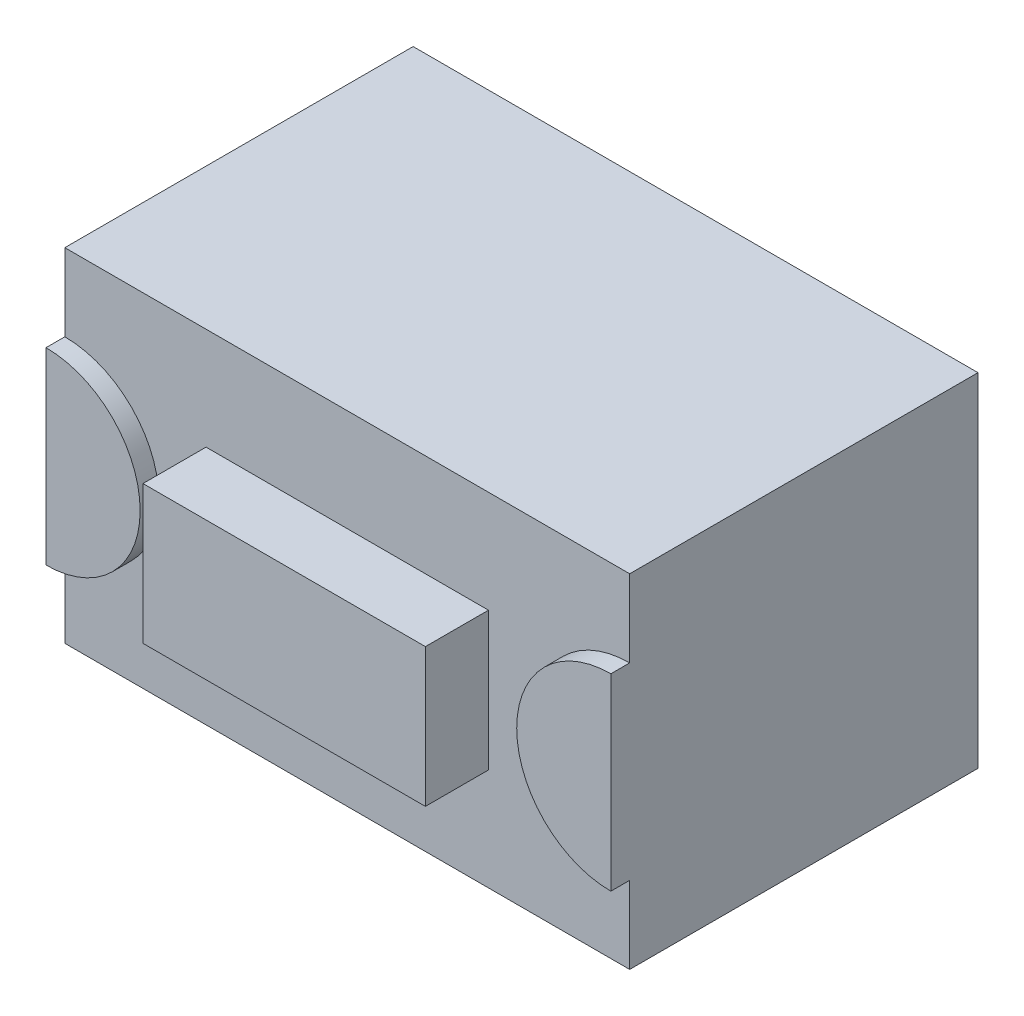
ISO-10303-21;
HEADER;
FILE_DESCRIPTION(('STEP AP214'),'2;1');
FILE_NAME('part.step','',(''),(''),'','','');
FILE_SCHEMA(('AUTOMOTIVE_DESIGN { 1 0 10303 214 1 1 1 1 }'));
ENDSEC;
DATA;
#1=APPLICATION_CONTEXT('core data for automotive mechanical design processes');
#2=APPLICATION_PROTOCOL_DEFINITION('international standard','automotive_design',2000,#1);
#3=PRODUCT_CONTEXT('',#1,'mechanical');
#4=PRODUCT('Part','Part','',(#3));
#5=PRODUCT_RELATED_PRODUCT_CATEGORY('part','',(#4));
#6=PRODUCT_DEFINITION_FORMATION('','',#4);
#7=PRODUCT_DEFINITION_CONTEXT('part definition',#1,'design');
#8=PRODUCT_DEFINITION('design','',#6,#7);
#9=PRODUCT_DEFINITION_SHAPE('','',#8);
#10=(LENGTH_UNIT() NAMED_UNIT(*) SI_UNIT(.MILLI.,.METRE.));
#11=(NAMED_UNIT(*) PLANE_ANGLE_UNIT() SI_UNIT($,.RADIAN.));
#12=(NAMED_UNIT(*) SI_UNIT($,.STERADIAN.) SOLID_ANGLE_UNIT());
#13=UNCERTAINTY_MEASURE_WITH_UNIT(LENGTH_MEASURE(1.E-05),#10,'distance_accuracy_value','');
#14=(GEOMETRIC_REPRESENTATION_CONTEXT(3) GLOBAL_UNCERTAINTY_ASSIGNED_CONTEXT((#13)) GLOBAL_UNIT_ASSIGNED_CONTEXT((#10,
#11,#12)) REPRESENTATION_CONTEXT('',''));
#15=CARTESIAN_POINT('',(0.,0.,0.));
#16=DIRECTION('',(0.,0.,1.));
#17=DIRECTION('',(1.,0.,0.));
#18=AXIS2_PLACEMENT_3D('',#15,#16,#17);
#19=CARTESIAN_POINT('',(0.,0.,4.37));
#20=DIRECTION('',(0.,0.,-1.));
#21=DIRECTION('',(-1.,0.,0.));
#22=AXIS2_PLACEMENT_3D('',#19,#20,#21);
#23=PLANE('',#22);
#24=DIRECTION('',(1.,0.,0.));
#25=VECTOR('',#24,1.);
#26=CARTESIAN_POINT('',(1.5,2.555,4.37));
#27=LINE('',#26,#25);
#28=CARTESIAN_POINT('',(4.5,2.555,4.37));
#29=VERTEX_POINT('',#28);
#30=CARTESIAN_POINT('',(1.5,2.555,4.37));
#31=VERTEX_POINT('',#30);
#32=EDGE_CURVE('E177',#29,#31,#27,.F.);
#33=ORIENTED_EDGE('',*,*,#32,.T.);
#34=DIRECTION('',(0.,1.,0.));
#35=VECTOR('',#34,1.);
#36=CARTESIAN_POINT('',(1.5,1.085,4.37));
#37=LINE('',#36,#35);
#38=CARTESIAN_POINT('',(1.5,1.085,4.37));
#39=VERTEX_POINT('',#38);
#40=EDGE_CURVE('E172',#31,#39,#37,.F.);
#41=ORIENTED_EDGE('',*,*,#40,.T.);
#42=DIRECTION('',(1.,0.,0.));
#43=VECTOR('',#42,1.);
#44=CARTESIAN_POINT('',(1.5,1.085,4.37));
#45=LINE('',#44,#43);
#46=CARTESIAN_POINT('',(4.5,1.085,4.37));
#47=VERTEX_POINT('',#46);
#48=EDGE_CURVE('E161',#39,#47,#45,.T.);
#49=ORIENTED_EDGE('',*,*,#48,.T.);
#50=DIRECTION('',(0.,1.,0.));
#51=VECTOR('',#50,1.);
#52=CARTESIAN_POINT('',(4.5,0.,4.37));
#53=LINE('',#52,#51);
#54=EDGE_CURVE('E137',#29,#47,#53,.F.);
#55=ORIENTED_EDGE('',*,*,#54,.F.);
#56=EDGE_LOOP('',(#33,#41,#49,#55));
#57=FACE_BOUND('',#56,.T.);
#58=ADVANCED_FACE('F17',(#57),#23,.F.);
#59=CARTESIAN_POINT('',(0.,1.82,3.9));
#60=DIRECTION('',(0.,0.,-1.));
#61=DIRECTION('',(-1.,0.,0.));
#62=AXIS2_PLACEMENT_3D('',#59,#60,#61);
#63=PLANE('',#62);
#64=DIRECTION('',(0.,1.,0.));
#65=VECTOR('',#64,1.);
#66=CARTESIAN_POINT('',(0.,0.,3.9));
#67=LINE('',#66,#65);
#68=CARTESIAN_POINT('',(0.,2.82,3.9));
#69=VERTEX_POINT('',#68);
#70=CARTESIAN_POINT('',(0.,0.82,3.9));
#71=VERTEX_POINT('',#70);
#72=EDGE_CURVE('E117',#69,#71,#67,.F.);
#73=ORIENTED_EDGE('',*,*,#72,.T.);
#74=CARTESIAN_POINT('',(0.,1.82,3.9));
#75=DIRECTION('',(0.,0.,-1.));
#76=DIRECTION('',(-1.,0.,0.));
#77=AXIS2_PLACEMENT_3D('',#74,#75,#76);
#78=CIRCLE('',#77,1.);
#79=EDGE_CURVE('E20',#69,#71,#78,.T.);
#80=ORIENTED_EDGE('',*,*,#79,.F.);
#81=EDGE_LOOP('',(#73,#80));
#82=FACE_BOUND('',#81,.T.);
#83=ADVANCED_FACE('F120',(#82),#63,.F.);
#84=CARTESIAN_POINT('',(0.,1.82,3.9));
#85=DIRECTION('',(0.,0.,-1.));
#86=DIRECTION('',(-1.,0.,0.));
#87=AXIS2_PLACEMENT_3D('',#84,#85,#86);
#88=CYLINDRICAL_SURFACE('',#87,1.);
#89=ORIENTED_EDGE('',*,*,#79,.T.);
#90=DIRECTION('',(0.,0.,-1.));
#91=VECTOR('',#90,1.);
#92=CARTESIAN_POINT('',(0.,0.82,3.7));
#93=LINE('',#92,#91);
#94=CARTESIAN_POINT('',(0.,0.82,3.7));
#95=VERTEX_POINT('',#94);
#96=EDGE_CURVE('E108',#71,#95,#93,.T.);
#97=ORIENTED_EDGE('',*,*,#96,.T.);
#98=CARTESIAN_POINT('',(0.,1.82,3.7));
#99=DIRECTION('',(0.,0.,-1.));
#100=DIRECTION('',(-1.,0.,0.));
#101=AXIS2_PLACEMENT_3D('',#98,#99,#100);
#102=CIRCLE('',#101,1.);
#103=CARTESIAN_POINT('',(0.,2.82,3.7));
#104=VERTEX_POINT('',#103);
#105=EDGE_CURVE('E143',#95,#104,#102,.F.);
#106=ORIENTED_EDGE('',*,*,#105,.T.);
#107=DIRECTION('',(0.,0.,-1.));
#108=VECTOR('',#107,1.);
#109=CARTESIAN_POINT('',(0.,2.82,3.7));
#110=LINE('',#109,#108);
#111=EDGE_CURVE('E110',#104,#69,#110,.F.);
#112=ORIENTED_EDGE('',*,*,#111,.T.);
#113=EDGE_LOOP('',(#89,#97,#106,#112));
#114=FACE_BOUND('',#113,.T.);
#115=ADVANCED_FACE('F106',(#114),#88,.T.);
#116=CARTESIAN_POINT('',(6.,1.82,3.9));
#117=DIRECTION('',(0.,0.,-1.));
#118=DIRECTION('',(-1.,0.,0.));
#119=AXIS2_PLACEMENT_3D('',#116,#117,#118);
#120=CYLINDRICAL_SURFACE('',#119,1.);
#121=DIRECTION('',(0.,0.,-1.));
#122=VECTOR('',#121,1.);
#123=CARTESIAN_POINT('',(6.,2.82,3.9));
#124=LINE('',#123,#122);
#125=CARTESIAN_POINT('',(6.,2.82,3.9));
#126=VERTEX_POINT('',#125);
#127=CARTESIAN_POINT('',(6.,2.82,3.7));
#128=VERTEX_POINT('',#127);
#129=EDGE_CURVE('E111',#126,#128,#124,.T.);
#130=ORIENTED_EDGE('',*,*,#129,.T.);
#131=CARTESIAN_POINT('',(6.,1.82,3.7));
#132=DIRECTION('',(0.,0.,-1.));
#133=DIRECTION('',(-1.,0.,0.));
#134=AXIS2_PLACEMENT_3D('',#131,#132,#133);
#135=CIRCLE('',#134,1.);
#136=CARTESIAN_POINT('',(6.,0.82,3.7));
#137=VERTEX_POINT('',#136);
#138=EDGE_CURVE('E139',#128,#137,#135,.F.);
#139=ORIENTED_EDGE('',*,*,#138,.T.);
#140=DIRECTION('',(0.,0.,-1.));
#141=VECTOR('',#140,1.);
#142=CARTESIAN_POINT('',(6.,0.82,3.9));
#143=LINE('',#142,#141);
#144=CARTESIAN_POINT('',(6.,0.82,3.9));
#145=VERTEX_POINT('',#144);
#146=EDGE_CURVE('E112',#137,#145,#143,.F.);
#147=ORIENTED_EDGE('',*,*,#146,.T.);
#148=CARTESIAN_POINT('',(6.,1.82,3.9));
#149=DIRECTION('',(0.,0.,-1.));
#150=DIRECTION('',(-1.,0.,0.));
#151=AXIS2_PLACEMENT_3D('',#148,#149,#150);
#152=CIRCLE('',#151,1.);
#153=EDGE_CURVE('E145',#126,#145,#152,.F.);
#154=ORIENTED_EDGE('',*,*,#153,.F.);
#155=EDGE_LOOP('',(#130,#139,#147,#154));
#156=FACE_BOUND('',#155,.T.);
#157=ADVANCED_FACE('F247',(#156),#120,.T.);
#158=CARTESIAN_POINT('',(1.5,2.555,4.37));
#159=DIRECTION('',(0.,-1.,0.));
#160=DIRECTION('',(0.,0.,-1.));
#161=AXIS2_PLACEMENT_3D('',#158,#159,#160);
#162=PLANE('',#161);
#163=DIRECTION('',(0.,0.,-1.));
#164=VECTOR('',#163,1.);
#165=CARTESIAN_POINT('',(1.5,2.555,4.37));
#166=LINE('',#165,#164);
#167=CARTESIAN_POINT('',(1.5,2.555,3.7));
#168=VERTEX_POINT('',#167);
#169=EDGE_CURVE('E174',#168,#31,#166,.F.);
#170=ORIENTED_EDGE('',*,*,#169,.T.);
#171=ORIENTED_EDGE('',*,*,#32,.F.);
#172=DIRECTION('',(0.,0.,1.));
#173=VECTOR('',#172,1.);
#174=CARTESIAN_POINT('',(4.5,2.555,4.37));
#175=LINE('',#174,#173);
#176=CARTESIAN_POINT('',(4.5,2.555,3.7));
#177=VERTEX_POINT('',#176);
#178=EDGE_CURVE('E147',#29,#177,#175,.F.);
#179=ORIENTED_EDGE('',*,*,#178,.T.);
#180=DIRECTION('',(-1.,0.,0.));
#181=VECTOR('',#180,1.);
#182=CARTESIAN_POINT('',(0.,2.555,3.7));
#183=LINE('',#182,#181);
#184=EDGE_CURVE('E141',#177,#168,#183,.T.);
#185=ORIENTED_EDGE('',*,*,#184,.T.);
#186=EDGE_LOOP('',(#170,#171,#179,#185));
#187=FACE_BOUND('',#186,.T.);
#188=ADVANCED_FACE('F346',(#187),#162,.F.);
#189=CARTESIAN_POINT('',(1.5,1.085,4.37));
#190=DIRECTION('',(1.,0.,0.));
#191=DIRECTION('',(0.,0.,-1.));
#192=AXIS2_PLACEMENT_3D('',#189,#190,#191);
#193=PLANE('',#192);
#194=DIRECTION('',(0.,0.,1.));
#195=VECTOR('',#194,1.);
#196=CARTESIAN_POINT('',(1.5,1.085,4.37));
#197=LINE('',#196,#195);
#198=CARTESIAN_POINT('',(1.5,1.085,3.7));
#199=VERTEX_POINT('',#198);
#200=EDGE_CURVE('E169',#199,#39,#197,.T.);
#201=ORIENTED_EDGE('',*,*,#200,.T.);
#202=ORIENTED_EDGE('',*,*,#40,.F.);
#203=ORIENTED_EDGE('',*,*,#169,.F.);
#204=DIRECTION('',(0.,1.,0.));
#205=VECTOR('',#204,1.);
#206=CARTESIAN_POINT('',(1.5,0.,3.7));
#207=LINE('',#206,#205);
#208=EDGE_CURVE('E195',#168,#199,#207,.F.);
#209=ORIENTED_EDGE('',*,*,#208,.T.);
#210=EDGE_LOOP('',(#201,#202,#203,#209));
#211=FACE_BOUND('',#210,.T.);
#212=ADVANCED_FACE('F336',(#211),#193,.F.);
#213=CARTESIAN_POINT('',(1.5,1.085,4.37));
#214=DIRECTION('',(0.,1.,0.));
#215=DIRECTION('',(0.,0.,1.));
#216=AXIS2_PLACEMENT_3D('',#213,#214,#215);
#217=PLANE('',#216);
#218=DIRECTION('',(0.,0.,1.));
#219=VECTOR('',#218,1.);
#220=CARTESIAN_POINT('',(4.5,1.085,4.37));
#221=LINE('',#220,#219);
#222=CARTESIAN_POINT('',(4.5,1.085,3.7));
#223=VERTEX_POINT('',#222);
#224=EDGE_CURVE('E153',#223,#47,#221,.T.);
#225=ORIENTED_EDGE('',*,*,#224,.T.);
#226=ORIENTED_EDGE('',*,*,#48,.F.);
#227=ORIENTED_EDGE('',*,*,#200,.F.);
#228=DIRECTION('',(-1.,0.,0.));
#229=VECTOR('',#228,1.);
#230=CARTESIAN_POINT('',(0.,1.085,3.7));
#231=LINE('',#230,#229);
#232=EDGE_CURVE('E192',#199,#223,#231,.F.);
#233=ORIENTED_EDGE('',*,*,#232,.T.);
#234=EDGE_LOOP('',(#225,#226,#227,#233));
#235=FACE_BOUND('',#234,.T.);
#236=ADVANCED_FACE('F258',(#235),#217,.F.);
#237=CARTESIAN_POINT('',(4.5,1.085,4.37));
#238=DIRECTION('',(-1.,0.,0.));
#239=DIRECTION('',(0.,0.,1.));
#240=AXIS2_PLACEMENT_3D('',#237,#238,#239);
#241=PLANE('',#240);
#242=ORIENTED_EDGE('',*,*,#178,.F.);
#243=ORIENTED_EDGE('',*,*,#54,.T.);
#244=ORIENTED_EDGE('',*,*,#224,.F.);
#245=DIRECTION('',(0.,1.,0.));
#246=VECTOR('',#245,1.);
#247=CARTESIAN_POINT('',(4.5,0.,3.7));
#248=LINE('',#247,#246);
#249=EDGE_CURVE('E189',#223,#177,#248,.T.);
#250=ORIENTED_EDGE('',*,*,#249,.T.);
#251=EDGE_LOOP('',(#242,#243,#244,#250));
#252=FACE_BOUND('',#251,.T.);
#253=ADVANCED_FACE('F250',(#252),#241,.F.);
#254=CARTESIAN_POINT('',(6.,1.82,3.9));
#255=DIRECTION('',(0.,0.,1.));
#256=DIRECTION('',(1.,0.,0.));
#257=AXIS2_PLACEMENT_3D('',#254,#255,#256);
#258=PLANE('',#257);
#259=ORIENTED_EDGE('',*,*,#153,.T.);
#260=DIRECTION('',(0.,1.,0.));
#261=VECTOR('',#260,1.);
#262=CARTESIAN_POINT('',(6.,0.,3.9));
#263=LINE('',#262,#261);
#264=EDGE_CURVE('E209',#145,#126,#263,.T.);
#265=ORIENTED_EDGE('',*,*,#264,.T.);
#266=EDGE_LOOP('',(#259,#265));
#267=FACE_BOUND('',#266,.T.);
#268=ADVANCED_FACE('F248',(#267),#258,.T.);
#269=CARTESIAN_POINT('',(0.,3.64,3.7));
#270=DIRECTION('',(0.,-1.,0.));
#271=DIRECTION('',(0.,0.,-1.));
#272=AXIS2_PLACEMENT_3D('',#269,#270,#271);
#273=PLANE('',#272);
#274=DIRECTION('',(0.,0.,-1.));
#275=VECTOR('',#274,1.);
#276=CARTESIAN_POINT('',(0.,3.64,3.7));
#277=LINE('',#276,#275);
#278=CARTESIAN_POINT('',(0.,3.64,0.));
#279=VERTEX_POINT('',#278);
#280=CARTESIAN_POINT('',(0.,3.64,3.7));
#281=VERTEX_POINT('',#280);
#282=EDGE_CURVE('E122',#279,#281,#277,.F.);
#283=ORIENTED_EDGE('',*,*,#282,.T.);
#284=DIRECTION('',(-1.,0.,0.));
#285=VECTOR('',#284,1.);
#286=CARTESIAN_POINT('',(0.,3.64,3.7));
#287=LINE('',#286,#285);
#288=CARTESIAN_POINT('',(6.,3.64,3.7));
#289=VERTEX_POINT('',#288);
#290=EDGE_CURVE('E142',#281,#289,#287,.F.);
#291=ORIENTED_EDGE('',*,*,#290,.T.);
#292=DIRECTION('',(0.,0.,1.));
#293=VECTOR('',#292,1.);
#294=CARTESIAN_POINT('',(6.,3.64,3.7));
#295=LINE('',#294,#293);
#296=CARTESIAN_POINT('',(6.,3.64,0.));
#297=VERTEX_POINT('',#296);
#298=EDGE_CURVE('E131',#289,#297,#295,.F.);
#299=ORIENTED_EDGE('',*,*,#298,.T.);
#300=DIRECTION('',(-1.,0.,0.));
#301=VECTOR('',#300,1.);
#302=CARTESIAN_POINT('',(0.,3.64,0.));
#303=LINE('',#302,#301);
#304=EDGE_CURVE('E130',#279,#297,#303,.F.);
#305=ORIENTED_EDGE('',*,*,#304,.F.);
#306=EDGE_LOOP('',(#283,#291,#299,#305));
#307=FACE_BOUND('',#306,.T.);
#308=ADVANCED_FACE('F243',(#307),#273,.F.);
#309=CARTESIAN_POINT('',(0.,0.,3.7));
#310=DIRECTION('',(1.,0.,0.));
#311=DIRECTION('',(0.,0.,-1.));
#312=AXIS2_PLACEMENT_3D('',#309,#310,#311);
#313=PLANE('',#312);
#314=DIRECTION('',(0.,0.,1.));
#315=VECTOR('',#314,1.);
#316=CARTESIAN_POINT('',(0.,0.,3.7));
#317=LINE('',#316,#315);
#318=CARTESIAN_POINT('',(0.,0.,0.));
#319=VERTEX_POINT('',#318);
#320=CARTESIAN_POINT('',(0.,0.,3.7));
#321=VERTEX_POINT('',#320);
#322=EDGE_CURVE('E182',#319,#321,#317,.T.);
#323=ORIENTED_EDGE('',*,*,#322,.T.);
#324=DIRECTION('',(0.,1.,0.));
#325=VECTOR('',#324,1.);
#326=CARTESIAN_POINT('',(0.,0.,3.7));
#327=LINE('',#326,#325);
#328=EDGE_CURVE('E118',#321,#95,#327,.T.);
#329=ORIENTED_EDGE('',*,*,#328,.T.);
#330=ORIENTED_EDGE('',*,*,#96,.F.);
#331=ORIENTED_EDGE('',*,*,#72,.F.);
#332=ORIENTED_EDGE('',*,*,#111,.F.);
#333=DIRECTION('',(0.,1.,0.));
#334=VECTOR('',#333,1.);
#335=CARTESIAN_POINT('',(0.,0.,3.7));
#336=LINE('',#335,#334);
#337=EDGE_CURVE('E144',#104,#281,#336,.T.);
#338=ORIENTED_EDGE('',*,*,#337,.T.);
#339=ORIENTED_EDGE('',*,*,#282,.F.);
#340=DIRECTION('',(0.,1.,0.));
#341=VECTOR('',#340,1.);
#342=CARTESIAN_POINT('',(0.,0.,0.));
#343=LINE('',#342,#341);
#344=EDGE_CURVE('E127',#319,#279,#343,.T.);
#345=ORIENTED_EDGE('',*,*,#344,.F.);
#346=EDGE_LOOP('',(#323,#329,#330,#331,#332,#338,#339,#345));
#347=FACE_BOUND('',#346,.T.);
#348=ADVANCED_FACE('F116',(#347),#313,.F.);
#349=CARTESIAN_POINT('',(0.,0.,3.7));
#350=DIRECTION('',(0.,0.,-1.));
#351=DIRECTION('',(-1.,0.,0.));
#352=AXIS2_PLACEMENT_3D('',#349,#350,#351);
#353=PLANE('',#352);
#354=ORIENTED_EDGE('',*,*,#232,.F.);
#355=ORIENTED_EDGE('',*,*,#208,.F.);
#356=ORIENTED_EDGE('',*,*,#184,.F.);
#357=ORIENTED_EDGE('',*,*,#249,.F.);
#358=EDGE_LOOP('',(#354,#355,#356,#357));
#359=FACE_BOUND('',#358,.T.);
#360=DIRECTION('',(0.,1.,0.));
#361=VECTOR('',#360,1.);
#362=CARTESIAN_POINT('',(6.,0.,3.7));
#363=LINE('',#362,#361);
#364=EDGE_CURVE('E206',#128,#289,#363,.T.);
#365=ORIENTED_EDGE('',*,*,#364,.T.);
#366=ORIENTED_EDGE('',*,*,#290,.F.);
#367=ORIENTED_EDGE('',*,*,#337,.F.);
#368=ORIENTED_EDGE('',*,*,#105,.F.);
#369=ORIENTED_EDGE('',*,*,#328,.F.);
#370=DIRECTION('',(1.,0.,0.));
#371=VECTOR('',#370,1.);
#372=CARTESIAN_POINT('',(0.,0.,3.7));
#373=LINE('',#372,#371);
#374=CARTESIAN_POINT('',(6.,0.,3.7));
#375=VERTEX_POINT('',#374);
#376=EDGE_CURVE('E183',#321,#375,#373,.T.);
#377=ORIENTED_EDGE('',*,*,#376,.T.);
#378=DIRECTION('',(0.,1.,0.));
#379=VECTOR('',#378,1.);
#380=CARTESIAN_POINT('',(6.,0.,3.7));
#381=LINE('',#380,#379);
#382=EDGE_CURVE('E191',#375,#137,#381,.T.);
#383=ORIENTED_EDGE('',*,*,#382,.T.);
#384=ORIENTED_EDGE('',*,*,#138,.F.);
#385=EDGE_LOOP('',(#365,#366,#367,#368,#369,#377,#383,#384));
#386=FACE_BOUND('',#385,.T.);
#387=ADVANCED_FACE('F236',(#359,#386),#353,.F.);
#388=CARTESIAN_POINT('',(6.,0.,3.7));
#389=DIRECTION('',(-1.,0.,0.));
#390=DIRECTION('',(0.,0.,1.));
#391=AXIS2_PLACEMENT_3D('',#388,#389,#390);
#392=PLANE('',#391);
#393=ORIENTED_EDGE('',*,*,#298,.F.);
#394=ORIENTED_EDGE('',*,*,#364,.F.);
#395=ORIENTED_EDGE('',*,*,#129,.F.);
#396=ORIENTED_EDGE('',*,*,#264,.F.);
#397=ORIENTED_EDGE('',*,*,#146,.F.);
#398=ORIENTED_EDGE('',*,*,#382,.F.);
#399=DIRECTION('',(0.,0.,1.));
#400=VECTOR('',#399,1.);
#401=CARTESIAN_POINT('',(6.,0.,3.7));
#402=LINE('',#401,#400);
#403=CARTESIAN_POINT('',(6.,0.,0.));
#404=VERTEX_POINT('',#403);
#405=EDGE_CURVE('E26',#375,#404,#402,.F.);
#406=ORIENTED_EDGE('',*,*,#405,.T.);
#407=DIRECTION('',(0.,1.,0.));
#408=VECTOR('',#407,1.);
#409=CARTESIAN_POINT('',(6.,0.,0.));
#410=LINE('',#409,#408);
#411=EDGE_CURVE('E34',#297,#404,#410,.F.);
#412=ORIENTED_EDGE('',*,*,#411,.F.);
#413=EDGE_LOOP('',(#393,#394,#395,#396,#397,#398,#406,#412));
#414=FACE_BOUND('',#413,.T.);
#415=ADVANCED_FACE('F230',(#414),#392,.F.);
#416=CARTESIAN_POINT('',(0.,0.,0.));
#417=DIRECTION('',(0.,0.,-1.));
#418=DIRECTION('',(-1.,0.,0.));
#419=AXIS2_PLACEMENT_3D('',#416,#417,#418);
#420=PLANE('',#419);
#421=ORIENTED_EDGE('',*,*,#411,.T.);
#422=DIRECTION('',(1.,0.,0.));
#423=VECTOR('',#422,1.);
#424=CARTESIAN_POINT('',(0.,0.,0.));
#425=LINE('',#424,#423);
#426=EDGE_CURVE('E11',#404,#319,#425,.F.);
#427=ORIENTED_EDGE('',*,*,#426,.T.);
#428=ORIENTED_EDGE('',*,*,#344,.T.);
#429=ORIENTED_EDGE('',*,*,#304,.T.);
#430=EDGE_LOOP('',(#421,#427,#428,#429));
#431=FACE_BOUND('',#430,.T.);
#432=ADVANCED_FACE('F242',(#431),#420,.T.);
#433=CARTESIAN_POINT('',(0.,0.,3.7));
#434=DIRECTION('',(0.,1.,0.));
#435=DIRECTION('',(0.,0.,1.));
#436=AXIS2_PLACEMENT_3D('',#433,#434,#435);
#437=PLANE('',#436);
#438=ORIENTED_EDGE('',*,*,#405,.F.);
#439=ORIENTED_EDGE('',*,*,#376,.F.);
#440=ORIENTED_EDGE('',*,*,#322,.F.);
#441=ORIENTED_EDGE('',*,*,#426,.F.);
#442=EDGE_LOOP('',(#438,#439,#440,#441));
#443=FACE_BOUND('',#442,.T.);
#444=ADVANCED_FACE('F234',(#443),#437,.F.);
#445=CLOSED_SHELL('',(#58,#83,#115,#157,#188,#212,#236,#253,#268,#308,#348,#387,#415,#432,#444));
#446=MANIFOLD_SOLID_BREP('B1',#445);
#447=ADVANCED_BREP_SHAPE_REPRESENTATION('',(#18,#446),#14);
#448=SHAPE_DEFINITION_REPRESENTATION(#9,#447);
ENDSEC;
END-ISO-10303-21;
